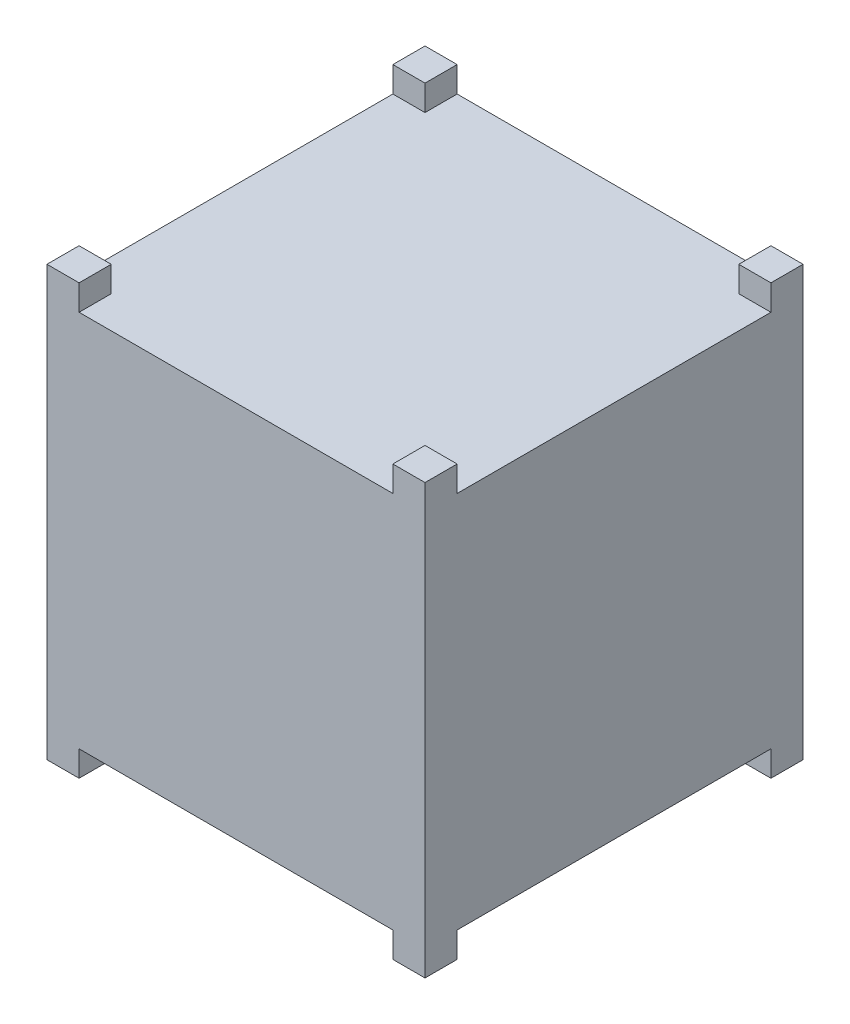
ISO-10303-21;
HEADER;
FILE_DESCRIPTION(('STEP AP214'),'2;1');
FILE_NAME('part.step','',(''),(''),'','','');
FILE_SCHEMA(('AUTOMOTIVE_DESIGN { 1 0 10303 214 1 1 1 1 }'));
ENDSEC;
DATA;
#1=APPLICATION_CONTEXT('core data for automotive mechanical design processes');
#2=APPLICATION_PROTOCOL_DEFINITION('international standard','automotive_design',2000,#1);
#3=PRODUCT_CONTEXT('',#1,'mechanical');
#4=PRODUCT('Part','Part','',(#3));
#5=PRODUCT_RELATED_PRODUCT_CATEGORY('part','',(#4));
#6=PRODUCT_DEFINITION_FORMATION('','',#4);
#7=PRODUCT_DEFINITION_CONTEXT('part definition',#1,'design');
#8=PRODUCT_DEFINITION('design','',#6,#7);
#9=PRODUCT_DEFINITION_SHAPE('','',#8);
#10=(LENGTH_UNIT() NAMED_UNIT(*) SI_UNIT(.MILLI.,.METRE.));
#11=(NAMED_UNIT(*) PLANE_ANGLE_UNIT() SI_UNIT($,.RADIAN.));
#12=(NAMED_UNIT(*) SI_UNIT($,.STERADIAN.) SOLID_ANGLE_UNIT());
#13=UNCERTAINTY_MEASURE_WITH_UNIT(LENGTH_MEASURE(1.E-05),#10,'distance_accuracy_value','');
#14=(GEOMETRIC_REPRESENTATION_CONTEXT(3) GLOBAL_UNCERTAINTY_ASSIGNED_CONTEXT((#13)) GLOBAL_UNIT_ASSIGNED_CONTEXT((#10,
#11,#12)) REPRESENTATION_CONTEXT('',''));
#15=CARTESIAN_POINT('',(0.,0.,0.));
#16=DIRECTION('',(0.,0.,1.));
#17=DIRECTION('',(1.,0.,0.));
#18=AXIS2_PLACEMENT_3D('',#15,#16,#17);
#19=CARTESIAN_POINT('',(0.,113.5,0.));
#20=DIRECTION('',(0.,0.,-1.));
#21=DIRECTION('',(-1.,0.,0.));
#22=AXIS2_PLACEMENT_3D('',#19,#20,#21);
#23=PLANE('',#22);
#24=DIRECTION('',(0.,-1.,0.));
#25=VECTOR('',#24,1.);
#26=CARTESIAN_POINT('',(8.50000000000002,6.75,0.));
#27=LINE('',#26,#25);
#28=CARTESIAN_POINT('',(8.50000000000002,6.75,0.));
#29=VERTEX_POINT('',#28);
#30=CARTESIAN_POINT('',(8.50000000000002,0.,0.));
#31=VERTEX_POINT('',#30);
#32=EDGE_CURVE('E228',#29,#31,#27,.T.);
#33=ORIENTED_EDGE('',*,*,#32,.F.);
#34=DIRECTION('',(-1.,0.,0.));
#35=VECTOR('',#34,1.);
#36=CARTESIAN_POINT('',(0.,6.75,0.));
#37=LINE('',#36,#35);
#38=CARTESIAN_POINT('',(91.5,6.75,0.));
#39=VERTEX_POINT('',#38);
#40=EDGE_CURVE('E234',#39,#29,#37,.T.);
#41=ORIENTED_EDGE('',*,*,#40,.F.);
#42=DIRECTION('',(0.,-1.,0.));
#43=VECTOR('',#42,1.);
#44=CARTESIAN_POINT('',(91.5,6.75,0.));
#45=LINE('',#44,#43);
#46=CARTESIAN_POINT('',(91.5,0.,0.));
#47=VERTEX_POINT('',#46);
#48=EDGE_CURVE('E252',#39,#47,#45,.T.);
#49=ORIENTED_EDGE('',*,*,#48,.T.);
#50=DIRECTION('',(1.,0.,0.));
#51=VECTOR('',#50,1.);
#52=CARTESIAN_POINT('',(0.,0.,0.));
#53=LINE('',#52,#51);
#54=CARTESIAN_POINT('',(100.,0.,0.));
#55=VERTEX_POINT('',#54);
#56=EDGE_CURVE('E397',#47,#55,#53,.T.);
#57=ORIENTED_EDGE('',*,*,#56,.T.);
#58=DIRECTION('',(0.,-1.,0.));
#59=VECTOR('',#58,1.);
#60=CARTESIAN_POINT('',(100.,113.5,0.));
#61=LINE('',#60,#59);
#62=CARTESIAN_POINT('',(100.,113.5,0.));
#63=VERTEX_POINT('',#62);
#64=EDGE_CURVE('E48',#63,#55,#61,.T.);
#65=ORIENTED_EDGE('',*,*,#64,.F.);
#66=DIRECTION('',(1.,0.,0.));
#67=VECTOR('',#66,1.);
#68=CARTESIAN_POINT('',(0.,113.5,0.));
#69=LINE('',#68,#67);
#70=CARTESIAN_POINT('',(91.5,113.5,0.));
#71=VERTEX_POINT('',#70);
#72=EDGE_CURVE('E376',#71,#63,#69,.T.);
#73=ORIENTED_EDGE('',*,*,#72,.F.);
#74=DIRECTION('',(0.,1.,0.));
#75=VECTOR('',#74,1.);
#76=CARTESIAN_POINT('',(91.5,106.75,0.));
#77=LINE('',#76,#75);
#78=CARTESIAN_POINT('',(91.5,106.75,0.));
#79=VERTEX_POINT('',#78);
#80=EDGE_CURVE('E63',#79,#71,#77,.T.);
#81=ORIENTED_EDGE('',*,*,#80,.F.);
#82=DIRECTION('',(1.,0.,0.));
#83=VECTOR('',#82,1.);
#84=CARTESIAN_POINT('',(0.,106.75,0.));
#85=LINE('',#84,#83);
#86=CARTESIAN_POINT('',(8.50000000000002,106.75,0.));
#87=VERTEX_POINT('',#86);
#88=EDGE_CURVE('E266',#87,#79,#85,.T.);
#89=ORIENTED_EDGE('',*,*,#88,.F.);
#90=DIRECTION('',(0.,1.,0.));
#91=VECTOR('',#90,1.);
#92=CARTESIAN_POINT('',(8.50000000000002,106.75,0.));
#93=LINE('',#92,#91);
#94=CARTESIAN_POINT('',(8.50000000000002,113.5,0.));
#95=VERTEX_POINT('',#94);
#96=EDGE_CURVE('E306',#87,#95,#93,.T.);
#97=ORIENTED_EDGE('',*,*,#96,.T.);
#98=CARTESIAN_POINT('',(0.,113.5,0.));
#99=VERTEX_POINT('',#98);
#100=EDGE_CURVE('E378',#99,#95,#69,.T.);
#101=ORIENTED_EDGE('',*,*,#100,.F.);
#102=DIRECTION('',(0.,-1.,0.));
#103=VECTOR('',#102,1.);
#104=CARTESIAN_POINT('',(0.,113.5,0.));
#105=LINE('',#104,#103);
#106=CARTESIAN_POINT('',(0.,0.,0.));
#107=VERTEX_POINT('',#106);
#108=EDGE_CURVE('E11',#99,#107,#105,.T.);
#109=ORIENTED_EDGE('',*,*,#108,.T.);
#110=EDGE_CURVE('E249',#107,#31,#53,.T.);
#111=ORIENTED_EDGE('',*,*,#110,.T.);
#112=EDGE_LOOP('',(#33,#41,#49,#57,#65,#73,#81,#89,#97,#101,#109,#111));
#113=FACE_BOUND('',#112,.T.);
#114=ADVANCED_FACE('F39',(#113),#23,.F.);
#115=CARTESIAN_POINT('',(0.,113.5,0.));
#116=DIRECTION('',(1.,0.,0.));
#117=DIRECTION('',(0.,0.,-1.));
#118=AXIS2_PLACEMENT_3D('',#115,#116,#117);
#119=PLANE('',#118);
#120=DIRECTION('',(0.,-1.,0.));
#121=VECTOR('',#120,1.);
#122=CARTESIAN_POINT('',(0.,6.75,-91.5000000000001));
#123=LINE('',#122,#121);
#124=CARTESIAN_POINT('',(0.,6.75,-91.5000000000001));
#125=VERTEX_POINT('',#124);
#126=CARTESIAN_POINT('',(0.,0.,-91.5000000000001));
#127=VERTEX_POINT('',#126);
#128=EDGE_CURVE('E463',#125,#127,#123,.T.);
#129=ORIENTED_EDGE('',*,*,#128,.F.);
#130=DIRECTION('',(0.,0.,-1.));
#131=VECTOR('',#130,1.);
#132=CARTESIAN_POINT('',(0.,6.75,0.));
#133=LINE('',#132,#131);
#134=CARTESIAN_POINT('',(0.,6.75,-8.49999999999999));
#135=VERTEX_POINT('',#134);
#136=EDGE_CURVE('E518',#135,#125,#133,.T.);
#137=ORIENTED_EDGE('',*,*,#136,.F.);
#138=DIRECTION('',(0.,-1.,0.));
#139=VECTOR('',#138,1.);
#140=CARTESIAN_POINT('',(0.,6.75,-8.49999999999999));
#141=LINE('',#140,#139);
#142=CARTESIAN_POINT('',(0.,0.,-8.49999999999999));
#143=VERTEX_POINT('',#142);
#144=EDGE_CURVE('E458',#135,#143,#141,.T.);
#145=ORIENTED_EDGE('',*,*,#144,.T.);
#146=DIRECTION('',(0.,0.,1.));
#147=VECTOR('',#146,1.);
#148=CARTESIAN_POINT('',(0.,0.,0.));
#149=LINE('',#148,#147);
#150=EDGE_CURVE('E336',#143,#107,#149,.T.);
#151=ORIENTED_EDGE('',*,*,#150,.T.);
#152=ORIENTED_EDGE('',*,*,#108,.F.);
#153=DIRECTION('',(0.,0.,1.));
#154=VECTOR('',#153,1.);
#155=CARTESIAN_POINT('',(0.,113.5,0.));
#156=LINE('',#155,#154);
#157=CARTESIAN_POINT('',(0.,113.5,-8.49999999999999));
#158=VERTEX_POINT('',#157);
#159=EDGE_CURVE('E377',#158,#99,#156,.T.);
#160=ORIENTED_EDGE('',*,*,#159,.F.);
#161=DIRECTION('',(0.,1.,0.));
#162=VECTOR('',#161,1.);
#163=CARTESIAN_POINT('',(0.,106.75,-8.49999999999999));
#164=LINE('',#163,#162);
#165=CARTESIAN_POINT('',(0.,106.75,-8.49999999999999));
#166=VERTEX_POINT('',#165);
#167=EDGE_CURVE('E337',#166,#158,#164,.T.);
#168=ORIENTED_EDGE('',*,*,#167,.F.);
#169=DIRECTION('',(0.,0.,1.));
#170=VECTOR('',#169,1.);
#171=CARTESIAN_POINT('',(0.,106.75,0.));
#172=LINE('',#171,#170);
#173=CARTESIAN_POINT('',(0.,106.75,-91.5000000000001));
#174=VERTEX_POINT('',#173);
#175=EDGE_CURVE('E300',#174,#166,#172,.T.);
#176=ORIENTED_EDGE('',*,*,#175,.F.);
#177=DIRECTION('',(0.,1.,0.));
#178=VECTOR('',#177,1.);
#179=CARTESIAN_POINT('',(0.,106.75,-91.5000000000001));
#180=LINE('',#179,#178);
#181=CARTESIAN_POINT('',(0.,113.5,-91.5000000000001));
#182=VERTEX_POINT('',#181);
#183=EDGE_CURVE('E340',#174,#182,#180,.T.);
#184=ORIENTED_EDGE('',*,*,#183,.T.);
#185=CARTESIAN_POINT('',(0.,113.5,-100.));
#186=VERTEX_POINT('',#185);
#187=EDGE_CURVE('E372',#186,#182,#156,.T.);
#188=ORIENTED_EDGE('',*,*,#187,.F.);
#189=DIRECTION('',(0.,-1.,0.));
#190=VECTOR('',#189,1.);
#191=CARTESIAN_POINT('',(0.,113.5,-100.));
#192=LINE('',#191,#190);
#193=CARTESIAN_POINT('',(0.,0.,-100.));
#194=VERTEX_POINT('',#193);
#195=EDGE_CURVE('E392',#186,#194,#192,.T.);
#196=ORIENTED_EDGE('',*,*,#195,.T.);
#197=EDGE_CURVE('E393',#194,#127,#149,.T.);
#198=ORIENTED_EDGE('',*,*,#197,.T.);
#199=EDGE_LOOP('',(#129,#137,#145,#151,#152,#160,#168,#176,#184,#188,#196,#198));
#200=FACE_BOUND('',#199,.T.);
#201=ADVANCED_FACE('F41',(#200),#119,.F.);
#202=CARTESIAN_POINT('',(100.,113.5,0.));
#203=DIRECTION('',(-1.,0.,0.));
#204=DIRECTION('',(0.,0.,1.));
#205=AXIS2_PLACEMENT_3D('',#202,#203,#204);
#206=PLANE('',#205);
#207=DIRECTION('',(0.,-1.,0.));
#208=VECTOR('',#207,1.);
#209=CARTESIAN_POINT('',(100.,6.75,-8.50000000000001));
#210=LINE('',#209,#208);
#211=CARTESIAN_POINT('',(100.,6.75,-8.50000000000001));
#212=VERTEX_POINT('',#211);
#213=CARTESIAN_POINT('',(100.,0.,-8.50000000000001));
#214=VERTEX_POINT('',#213);
#215=EDGE_CURVE('E483',#212,#214,#210,.T.);
#216=ORIENTED_EDGE('',*,*,#215,.F.);
#217=DIRECTION('',(0.,0.,1.));
#218=VECTOR('',#217,1.);
#219=CARTESIAN_POINT('',(100.,6.75,0.));
#220=LINE('',#219,#218);
#221=CARTESIAN_POINT('',(100.,6.75,-91.5000000000001));
#222=VERTEX_POINT('',#221);
#223=EDGE_CURVE('E493',#222,#212,#220,.T.);
#224=ORIENTED_EDGE('',*,*,#223,.F.);
#225=DIRECTION('',(0.,-1.,0.));
#226=VECTOR('',#225,1.);
#227=CARTESIAN_POINT('',(100.,6.75,-91.5000000000001));
#228=LINE('',#227,#226);
#229=CARTESIAN_POINT('',(100.,0.,-91.5000000000001));
#230=VERTEX_POINT('',#229);
#231=EDGE_CURVE('E479',#222,#230,#228,.T.);
#232=ORIENTED_EDGE('',*,*,#231,.T.);
#233=DIRECTION('',(0.,0.,-1.));
#234=VECTOR('',#233,1.);
#235=CARTESIAN_POINT('',(100.,0.,0.));
#236=LINE('',#235,#234);
#237=CARTESIAN_POINT('',(100.,0.,-100.));
#238=VERTEX_POINT('',#237);
#239=EDGE_CURVE('E400',#230,#238,#236,.T.);
#240=ORIENTED_EDGE('',*,*,#239,.T.);
#241=DIRECTION('',(0.,-1.,0.));
#242=VECTOR('',#241,1.);
#243=CARTESIAN_POINT('',(100.,113.5,-100.));
#244=LINE('',#243,#242);
#245=CARTESIAN_POINT('',(100.,113.5,-100.));
#246=VERTEX_POINT('',#245);
#247=EDGE_CURVE('E413',#246,#238,#244,.T.);
#248=ORIENTED_EDGE('',*,*,#247,.F.);
#249=DIRECTION('',(0.,0.,-1.));
#250=VECTOR('',#249,1.);
#251=CARTESIAN_POINT('',(100.,113.5,0.));
#252=LINE('',#251,#250);
#253=CARTESIAN_POINT('',(100.,113.5,-91.5000000000001));
#254=VERTEX_POINT('',#253);
#255=EDGE_CURVE('E382',#254,#246,#252,.T.);
#256=ORIENTED_EDGE('',*,*,#255,.F.);
#257=DIRECTION('',(0.,1.,0.));
#258=VECTOR('',#257,1.);
#259=CARTESIAN_POINT('',(100.,106.75,-91.5000000000001));
#260=LINE('',#259,#258);
#261=CARTESIAN_POINT('',(100.,106.75,-91.5000000000001));
#262=VERTEX_POINT('',#261);
#263=EDGE_CURVE('E357',#262,#254,#260,.T.);
#264=ORIENTED_EDGE('',*,*,#263,.F.);
#265=DIRECTION('',(0.,0.,-1.));
#266=VECTOR('',#265,1.);
#267=CARTESIAN_POINT('',(100.,106.75,0.));
#268=LINE('',#267,#266);
#269=CARTESIAN_POINT('',(100.,106.75,-8.50000000000001));
#270=VERTEX_POINT('',#269);
#271=EDGE_CURVE('E278',#270,#262,#268,.T.);
#272=ORIENTED_EDGE('',*,*,#271,.F.);
#273=DIRECTION('',(0.,1.,0.));
#274=VECTOR('',#273,1.);
#275=CARTESIAN_POINT('',(100.,106.75,-8.50000000000001));
#276=LINE('',#275,#274);
#277=CARTESIAN_POINT('',(100.,113.5,-8.50000000000001));
#278=VERTEX_POINT('',#277);
#279=EDGE_CURVE('E360',#270,#278,#276,.T.);
#280=ORIENTED_EDGE('',*,*,#279,.T.);
#281=EDGE_CURVE('E383',#63,#278,#252,.T.);
#282=ORIENTED_EDGE('',*,*,#281,.F.);
#283=ORIENTED_EDGE('',*,*,#64,.T.);
#284=EDGE_CURVE('E401',#55,#214,#236,.T.);
#285=ORIENTED_EDGE('',*,*,#284,.T.);
#286=EDGE_LOOP('',(#216,#224,#232,#240,#248,#256,#264,#272,#280,#282,#283,#285));
#287=FACE_BOUND('',#286,.T.);
#288=ADVANCED_FACE('F423',(#287),#206,.F.);
#289=CARTESIAN_POINT('',(0.,113.5,-100.));
#290=DIRECTION('',(0.,0.,1.));
#291=DIRECTION('',(1.,0.,0.));
#292=AXIS2_PLACEMENT_3D('',#289,#290,#291);
#293=PLANE('',#292);
#294=DIRECTION('',(0.,-1.,0.));
#295=VECTOR('',#294,1.);
#296=CARTESIAN_POINT('',(91.5,6.75,-100.));
#297=LINE('',#296,#295);
#298=CARTESIAN_POINT('',(91.5,6.75,-100.));
#299=VERTEX_POINT('',#298);
#300=CARTESIAN_POINT('',(91.5,0.,-100.));
#301=VERTEX_POINT('',#300);
#302=EDGE_CURVE('E473',#299,#301,#297,.T.);
#303=ORIENTED_EDGE('',*,*,#302,.F.);
#304=DIRECTION('',(1.,0.,0.));
#305=VECTOR('',#304,1.);
#306=CARTESIAN_POINT('',(0.,6.75,-100.));
#307=LINE('',#306,#305);
#308=CARTESIAN_POINT('',(8.5,6.75,-100.));
#309=VERTEX_POINT('',#308);
#310=EDGE_CURVE('E507',#309,#299,#307,.T.);
#311=ORIENTED_EDGE('',*,*,#310,.F.);
#312=DIRECTION('',(0.,-1.,0.));
#313=VECTOR('',#312,1.);
#314=CARTESIAN_POINT('',(8.5,6.75,-100.));
#315=LINE('',#314,#313);
#316=CARTESIAN_POINT('',(8.5,0.,-100.));
#317=VERTEX_POINT('',#316);
#318=EDGE_CURVE('E469',#309,#317,#315,.T.);
#319=ORIENTED_EDGE('',*,*,#318,.T.);
#320=DIRECTION('',(-1.,0.,0.));
#321=VECTOR('',#320,1.);
#322=CARTESIAN_POINT('',(0.,0.,-100.));
#323=LINE('',#322,#321);
#324=EDGE_CURVE('E405',#317,#194,#323,.T.);
#325=ORIENTED_EDGE('',*,*,#324,.T.);
#326=ORIENTED_EDGE('',*,*,#195,.F.);
#327=DIRECTION('',(-1.,0.,0.));
#328=VECTOR('',#327,1.);
#329=CARTESIAN_POINT('',(0.,113.5,-100.));
#330=LINE('',#329,#328);
#331=CARTESIAN_POINT('',(8.5,113.5,-100.));
#332=VERTEX_POINT('',#331);
#333=EDGE_CURVE('E387',#332,#186,#330,.T.);
#334=ORIENTED_EDGE('',*,*,#333,.F.);
#335=DIRECTION('',(0.,1.,0.));
#336=VECTOR('',#335,1.);
#337=CARTESIAN_POINT('',(8.5,106.75,-100.));
#338=LINE('',#337,#336);
#339=CARTESIAN_POINT('',(8.5,106.75,-100.));
#340=VERTEX_POINT('',#339);
#341=EDGE_CURVE('E347',#340,#332,#338,.T.);
#342=ORIENTED_EDGE('',*,*,#341,.F.);
#343=DIRECTION('',(-1.,0.,0.));
#344=VECTOR('',#343,1.);
#345=CARTESIAN_POINT('',(0.,106.75,-100.));
#346=LINE('',#345,#344);
#347=CARTESIAN_POINT('',(91.5,106.75,-100.));
#348=VERTEX_POINT('',#347);
#349=EDGE_CURVE('E289',#348,#340,#346,.T.);
#350=ORIENTED_EDGE('',*,*,#349,.F.);
#351=DIRECTION('',(0.,1.,0.));
#352=VECTOR('',#351,1.);
#353=CARTESIAN_POINT('',(91.5,106.75,-100.));
#354=LINE('',#353,#352);
#355=CARTESIAN_POINT('',(91.5,113.5,-100.));
#356=VERTEX_POINT('',#355);
#357=EDGE_CURVE('E350',#348,#356,#354,.T.);
#358=ORIENTED_EDGE('',*,*,#357,.T.);
#359=EDGE_CURVE('E388',#246,#356,#330,.T.);
#360=ORIENTED_EDGE('',*,*,#359,.F.);
#361=ORIENTED_EDGE('',*,*,#247,.T.);
#362=EDGE_CURVE('E406',#238,#301,#323,.T.);
#363=ORIENTED_EDGE('',*,*,#362,.T.);
#364=EDGE_LOOP('',(#303,#311,#319,#325,#326,#334,#342,#350,#358,#360,#361,#363));
#365=FACE_BOUND('',#364,.T.);
#366=ADVANCED_FACE('F545',(#365),#293,.F.);
#367=CARTESIAN_POINT('',(0.,0.,0.));
#368=DIRECTION('',(0.,-1.,0.));
#369=DIRECTION('',(0.,0.,-1.));
#370=AXIS2_PLACEMENT_3D('',#367,#368,#369);
#371=PLANE('',#370);
#372=DIRECTION('',(0.,0.,1.));
#373=VECTOR('',#372,1.);
#374=CARTESIAN_POINT('',(91.5,0.,0.));
#375=LINE('',#374,#373);
#376=CARTESIAN_POINT('',(91.5,0.,-8.50000000000001));
#377=VERTEX_POINT('',#376);
#378=EDGE_CURVE('E432',#377,#47,#375,.T.);
#379=ORIENTED_EDGE('',*,*,#378,.F.);
#380=DIRECTION('',(1.,0.,0.));
#381=VECTOR('',#380,1.);
#382=CARTESIAN_POINT('',(0.,0.,-8.49999999999999));
#383=LINE('',#382,#381);
#384=EDGE_CURVE('E431',#377,#214,#383,.T.);
#385=ORIENTED_EDGE('',*,*,#384,.T.);
#386=ORIENTED_EDGE('',*,*,#284,.F.);
#387=ORIENTED_EDGE('',*,*,#56,.F.);
#388=EDGE_LOOP('',(#379,#385,#386,#387));
#389=FACE_BOUND('',#388,.T.);
#390=ADVANCED_FACE('F429',(#389),#371,.T.);
#391=DIRECTION('',(1.,0.,0.));
#392=VECTOR('',#391,1.);
#393=CARTESIAN_POINT('',(0.,0.,-91.5000000000001));
#394=LINE('',#393,#392);
#395=CARTESIAN_POINT('',(91.5,0.,-91.5000000000001));
#396=VERTEX_POINT('',#395);
#397=EDGE_CURVE('E435',#396,#230,#394,.T.);
#398=ORIENTED_EDGE('',*,*,#397,.F.);
#399=DIRECTION('',(0.,0.,-1.));
#400=VECTOR('',#399,1.);
#401=CARTESIAN_POINT('',(91.5,0.,0.));
#402=LINE('',#401,#400);
#403=EDGE_CURVE('E439',#396,#301,#402,.T.);
#404=ORIENTED_EDGE('',*,*,#403,.T.);
#405=ORIENTED_EDGE('',*,*,#362,.F.);
#406=ORIENTED_EDGE('',*,*,#239,.F.);
#407=EDGE_LOOP('',(#398,#404,#405,#406));
#408=FACE_BOUND('',#407,.T.);
#409=ADVANCED_FACE('F562',(#408),#371,.T.);
#410=DIRECTION('',(-1.,0.,0.));
#411=VECTOR('',#410,1.);
#412=CARTESIAN_POINT('',(0.,0.,-8.49999999999999));
#413=LINE('',#412,#411);
#414=CARTESIAN_POINT('',(8.50000000000002,0.,-8.49999999999999));
#415=VERTEX_POINT('',#414);
#416=EDGE_CURVE('E235',#415,#143,#413,.T.);
#417=ORIENTED_EDGE('',*,*,#416,.F.);
#418=DIRECTION('',(0.,0.,1.));
#419=VECTOR('',#418,1.);
#420=CARTESIAN_POINT('',(8.50000000000002,0.,0.));
#421=LINE('',#420,#419);
#422=EDGE_CURVE('E55',#415,#31,#421,.T.);
#423=ORIENTED_EDGE('',*,*,#422,.T.);
#424=ORIENTED_EDGE('',*,*,#110,.F.);
#425=ORIENTED_EDGE('',*,*,#150,.F.);
#426=EDGE_LOOP('',(#417,#423,#424,#425));
#427=FACE_BOUND('',#426,.T.);
#428=ADVANCED_FACE('F526',(#427),#371,.T.);
#429=CARTESIAN_POINT('',(0.,113.5,0.));
#430=DIRECTION('',(0.,-1.,0.));
#431=DIRECTION('',(0.,0.,-1.));
#432=AXIS2_PLACEMENT_3D('',#429,#430,#431);
#433=PLANE('',#432);
#434=DIRECTION('',(0.,0.,-1.));
#435=VECTOR('',#434,1.);
#436=CARTESIAN_POINT('',(8.50000000000002,113.5,0.));
#437=LINE('',#436,#435);
#438=CARTESIAN_POINT('',(8.50000000000002,113.5,-8.49999999999999));
#439=VERTEX_POINT('',#438);
#440=EDGE_CURVE('E251',#95,#439,#437,.T.);
#441=ORIENTED_EDGE('',*,*,#440,.T.);
#442=DIRECTION('',(1.,0.,0.));
#443=VECTOR('',#442,1.);
#444=CARTESIAN_POINT('',(0.,113.5,-8.49999999999999));
#445=LINE('',#444,#443);
#446=EDGE_CURVE('E267',#158,#439,#445,.T.);
#447=ORIENTED_EDGE('',*,*,#446,.F.);
#448=ORIENTED_EDGE('',*,*,#159,.T.);
#449=ORIENTED_EDGE('',*,*,#100,.T.);
#450=EDGE_LOOP('',(#441,#447,#448,#449));
#451=FACE_BOUND('',#450,.T.);
#452=ADVANCED_FACE('F591',(#451),#433,.F.);
#453=DIRECTION('',(1.,0.,0.));
#454=VECTOR('',#453,1.);
#455=CARTESIAN_POINT('',(0.,113.5,-91.5000000000001));
#456=LINE('',#455,#454);
#457=CARTESIAN_POINT('',(8.50000000000001,113.5,-91.5000000000001));
#458=VERTEX_POINT('',#457);
#459=EDGE_CURVE('E326',#182,#458,#456,.T.);
#460=ORIENTED_EDGE('',*,*,#459,.T.);
#461=DIRECTION('',(0.,0.,1.));
#462=VECTOR('',#461,1.);
#463=CARTESIAN_POINT('',(8.50000000000005,113.5,0.));
#464=LINE('',#463,#462);
#465=EDGE_CURVE('E322',#332,#458,#464,.T.);
#466=ORIENTED_EDGE('',*,*,#465,.F.);
#467=ORIENTED_EDGE('',*,*,#333,.T.);
#468=ORIENTED_EDGE('',*,*,#187,.T.);
#469=EDGE_LOOP('',(#460,#466,#467,#468));
#470=FACE_BOUND('',#469,.T.);
#471=ADVANCED_FACE('F594',(#470),#433,.F.);
#472=DIRECTION('',(0.,0.,1.));
#473=VECTOR('',#472,1.);
#474=CARTESIAN_POINT('',(91.5,113.5,0.));
#475=LINE('',#474,#473);
#476=CARTESIAN_POINT('',(91.5,113.5,-91.5000000000001));
#477=VERTEX_POINT('',#476);
#478=EDGE_CURVE('E318',#356,#477,#475,.T.);
#479=ORIENTED_EDGE('',*,*,#478,.T.);
#480=DIRECTION('',(-1.,0.,0.));
#481=VECTOR('',#480,1.);
#482=CARTESIAN_POINT('',(0.,113.5,-91.5000000000001));
#483=LINE('',#482,#481);
#484=EDGE_CURVE('E314',#254,#477,#483,.T.);
#485=ORIENTED_EDGE('',*,*,#484,.F.);
#486=ORIENTED_EDGE('',*,*,#255,.T.);
#487=ORIENTED_EDGE('',*,*,#359,.T.);
#488=EDGE_LOOP('',(#479,#485,#486,#487));
#489=FACE_BOUND('',#488,.T.);
#490=ADVANCED_FACE('F710',(#489),#433,.F.);
#491=DIRECTION('',(-1.,0.,0.));
#492=VECTOR('',#491,1.);
#493=CARTESIAN_POINT('',(0.,113.5,-8.49999999999999));
#494=LINE('',#493,#492);
#495=CARTESIAN_POINT('',(91.5,113.5,-8.50000000000001));
#496=VERTEX_POINT('',#495);
#497=EDGE_CURVE('E310',#278,#496,#494,.T.);
#498=ORIENTED_EDGE('',*,*,#497,.T.);
#499=DIRECTION('',(0.,0.,-1.));
#500=VECTOR('',#499,1.);
#501=CARTESIAN_POINT('',(91.5,113.5,0.));
#502=LINE('',#501,#500);
#503=EDGE_CURVE('E257',#71,#496,#502,.T.);
#504=ORIENTED_EDGE('',*,*,#503,.F.);
#505=ORIENTED_EDGE('',*,*,#72,.T.);
#506=ORIENTED_EDGE('',*,*,#281,.T.);
#507=EDGE_LOOP('',(#498,#504,#505,#506));
#508=FACE_BOUND('',#507,.T.);
#509=ADVANCED_FACE('F590',(#508),#433,.F.);
#510=DIRECTION('',(0.,0.,-1.));
#511=VECTOR('',#510,1.);
#512=CARTESIAN_POINT('',(8.50000000000005,0.,0.));
#513=LINE('',#512,#511);
#514=CARTESIAN_POINT('',(8.50000000000001,0.,-91.5000000000001));
#515=VERTEX_POINT('',#514);
#516=EDGE_CURVE('E447',#515,#317,#513,.T.);
#517=ORIENTED_EDGE('',*,*,#516,.F.);
#518=DIRECTION('',(-1.,0.,0.));
#519=VECTOR('',#518,1.);
#520=CARTESIAN_POINT('',(0.,0.,-91.5000000000001));
#521=LINE('',#520,#519);
#522=EDGE_CURVE('E450',#515,#127,#521,.T.);
#523=ORIENTED_EDGE('',*,*,#522,.T.);
#524=ORIENTED_EDGE('',*,*,#197,.F.);
#525=ORIENTED_EDGE('',*,*,#324,.F.);
#526=EDGE_LOOP('',(#517,#523,#524,#525));
#527=FACE_BOUND('',#526,.T.);
#528=ADVANCED_FACE('F549',(#527),#371,.T.);
#529=CARTESIAN_POINT('',(8.50000000000002,106.75,0.));
#530=DIRECTION('',(1.,0.,0.));
#531=DIRECTION('',(0.,0.,-1.));
#532=AXIS2_PLACEMENT_3D('',#529,#530,#531);
#533=PLANE('',#532);
#534=ORIENTED_EDGE('',*,*,#440,.F.);
#535=ORIENTED_EDGE('',*,*,#96,.F.);
#536=DIRECTION('',(0.,0.,-1.));
#537=VECTOR('',#536,1.);
#538=CARTESIAN_POINT('',(8.50000000000002,106.75,0.));
#539=LINE('',#538,#537);
#540=CARTESIAN_POINT('',(8.50000000000002,106.75,-8.49999999999999));
#541=VERTEX_POINT('',#540);
#542=EDGE_CURVE('E263',#87,#541,#539,.T.);
#543=ORIENTED_EDGE('',*,*,#542,.T.);
#544=DIRECTION('',(0.,1.,0.));
#545=VECTOR('',#544,1.);
#546=CARTESIAN_POINT('',(8.50000000000002,106.75,-8.49999999999999));
#547=LINE('',#546,#545);
#548=EDGE_CURVE('E333',#541,#439,#547,.T.);
#549=ORIENTED_EDGE('',*,*,#548,.T.);
#550=EDGE_LOOP('',(#534,#535,#543,#549));
#551=FACE_BOUND('',#550,.T.);
#552=ADVANCED_FACE('F589',(#551),#533,.T.);
#553=CARTESIAN_POINT('',(0.,106.75,-8.49999999999999));
#554=DIRECTION('',(0.,0.,1.));
#555=DIRECTION('',(1.,0.,0.));
#556=AXIS2_PLACEMENT_3D('',#553,#554,#555);
#557=PLANE('',#556);
#558=ORIENTED_EDGE('',*,*,#446,.T.);
#559=ORIENTED_EDGE('',*,*,#548,.F.);
#560=DIRECTION('',(1.,0.,0.));
#561=VECTOR('',#560,1.);
#562=CARTESIAN_POINT('',(0.,106.75,-8.49999999999999));
#563=LINE('',#562,#561);
#564=EDGE_CURVE('E303',#166,#541,#563,.T.);
#565=ORIENTED_EDGE('',*,*,#564,.F.);
#566=ORIENTED_EDGE('',*,*,#167,.T.);
#567=EDGE_LOOP('',(#558,#559,#565,#566));
#568=FACE_BOUND('',#567,.T.);
#569=ADVANCED_FACE('F598',(#568),#557,.F.);
#570=CARTESIAN_POINT('',(0.,106.75,-91.5000000000001));
#571=DIRECTION('',(0.,0.,1.));
#572=DIRECTION('',(1.,0.,0.));
#573=AXIS2_PLACEMENT_3D('',#570,#571,#572);
#574=PLANE('',#573);
#575=ORIENTED_EDGE('',*,*,#459,.F.);
#576=ORIENTED_EDGE('',*,*,#183,.F.);
#577=DIRECTION('',(1.,0.,0.));
#578=VECTOR('',#577,1.);
#579=CARTESIAN_POINT('',(0.,106.75,-91.5000000000001));
#580=LINE('',#579,#578);
#581=CARTESIAN_POINT('',(8.50000000000001,106.75,-91.5000000000001));
#582=VERTEX_POINT('',#581);
#583=EDGE_CURVE('E297',#174,#582,#580,.T.);
#584=ORIENTED_EDGE('',*,*,#583,.T.);
#585=DIRECTION('',(0.,1.,0.));
#586=VECTOR('',#585,1.);
#587=CARTESIAN_POINT('',(8.50000000000001,106.75,-91.5000000000001));
#588=LINE('',#587,#586);
#589=EDGE_CURVE('E344',#582,#458,#588,.T.);
#590=ORIENTED_EDGE('',*,*,#589,.T.);
#591=EDGE_LOOP('',(#575,#576,#584,#590));
#592=FACE_BOUND('',#591,.T.);
#593=ADVANCED_FACE('F619',(#592),#574,.T.);
#594=CARTESIAN_POINT('',(8.50000000000005,106.75,0.));
#595=DIRECTION('',(-1.,0.,0.));
#596=DIRECTION('',(0.,0.,1.));
#597=AXIS2_PLACEMENT_3D('',#594,#595,#596);
#598=PLANE('',#597);
#599=ORIENTED_EDGE('',*,*,#465,.T.);
#600=ORIENTED_EDGE('',*,*,#589,.F.);
#601=DIRECTION('',(0.,0.,1.));
#602=VECTOR('',#601,1.);
#603=CARTESIAN_POINT('',(8.50000000000005,106.75,0.));
#604=LINE('',#603,#602);
#605=EDGE_CURVE('E293',#340,#582,#604,.T.);
#606=ORIENTED_EDGE('',*,*,#605,.F.);
#607=ORIENTED_EDGE('',*,*,#341,.T.);
#608=EDGE_LOOP('',(#599,#600,#606,#607));
#609=FACE_BOUND('',#608,.T.);
#610=ADVANCED_FACE('F615',(#609),#598,.F.);
#611=CARTESIAN_POINT('',(91.5,106.75,0.));
#612=DIRECTION('',(-1.,0.,0.));
#613=DIRECTION('',(0.,0.,1.));
#614=AXIS2_PLACEMENT_3D('',#611,#612,#613);
#615=PLANE('',#614);
#616=ORIENTED_EDGE('',*,*,#478,.F.);
#617=ORIENTED_EDGE('',*,*,#357,.F.);
#618=DIRECTION('',(0.,0.,1.));
#619=VECTOR('',#618,1.);
#620=CARTESIAN_POINT('',(91.5,106.75,0.));
#621=LINE('',#620,#619);
#622=CARTESIAN_POINT('',(91.5,106.75,-91.5000000000001));
#623=VERTEX_POINT('',#622);
#624=EDGE_CURVE('E286',#348,#623,#621,.T.);
#625=ORIENTED_EDGE('',*,*,#624,.T.);
#626=DIRECTION('',(0.,1.,0.));
#627=VECTOR('',#626,1.);
#628=CARTESIAN_POINT('',(91.5,106.75,-91.5000000000001));
#629=LINE('',#628,#627);
#630=EDGE_CURVE('E354',#623,#477,#629,.T.);
#631=ORIENTED_EDGE('',*,*,#630,.T.);
#632=EDGE_LOOP('',(#616,#617,#625,#631));
#633=FACE_BOUND('',#632,.T.);
#634=ADVANCED_FACE('F611',(#633),#615,.T.);
#635=CARTESIAN_POINT('',(0.,106.75,-91.5000000000001));
#636=DIRECTION('',(0.,0.,-1.));
#637=DIRECTION('',(-1.,0.,0.));
#638=AXIS2_PLACEMENT_3D('',#635,#636,#637);
#639=PLANE('',#638);
#640=ORIENTED_EDGE('',*,*,#484,.T.);
#641=ORIENTED_EDGE('',*,*,#630,.F.);
#642=DIRECTION('',(-1.,0.,0.));
#643=VECTOR('',#642,1.);
#644=CARTESIAN_POINT('',(0.,106.75,-91.5000000000001));
#645=LINE('',#644,#643);
#646=EDGE_CURVE('E282',#262,#623,#645,.T.);
#647=ORIENTED_EDGE('',*,*,#646,.F.);
#648=ORIENTED_EDGE('',*,*,#263,.T.);
#649=EDGE_LOOP('',(#640,#641,#647,#648));
#650=FACE_BOUND('',#649,.T.);
#651=ADVANCED_FACE('F607',(#650),#639,.F.);
#652=CARTESIAN_POINT('',(0.,106.75,-8.49999999999999));
#653=DIRECTION('',(0.,0.,-1.));
#654=DIRECTION('',(-1.,0.,0.));
#655=AXIS2_PLACEMENT_3D('',#652,#653,#654);
#656=PLANE('',#655);
#657=ORIENTED_EDGE('',*,*,#497,.F.);
#658=ORIENTED_EDGE('',*,*,#279,.F.);
#659=DIRECTION('',(-1.,0.,0.));
#660=VECTOR('',#659,1.);
#661=CARTESIAN_POINT('',(0.,106.75,-8.49999999999999));
#662=LINE('',#661,#660);
#663=CARTESIAN_POINT('',(91.5,106.75,-8.50000000000001));
#664=VERTEX_POINT('',#663);
#665=EDGE_CURVE('E275',#270,#664,#662,.T.);
#666=ORIENTED_EDGE('',*,*,#665,.T.);
#667=DIRECTION('',(0.,1.,0.));
#668=VECTOR('',#667,1.);
#669=CARTESIAN_POINT('',(91.5,106.75,-8.50000000000001));
#670=LINE('',#669,#668);
#671=EDGE_CURVE('E364',#664,#496,#670,.T.);
#672=ORIENTED_EDGE('',*,*,#671,.T.);
#673=EDGE_LOOP('',(#657,#658,#666,#672));
#674=FACE_BOUND('',#673,.T.);
#675=ADVANCED_FACE('F604',(#674),#656,.T.);
#676=CARTESIAN_POINT('',(91.5,106.75,0.));
#677=DIRECTION('',(1.,0.,0.));
#678=DIRECTION('',(0.,0.,-1.));
#679=AXIS2_PLACEMENT_3D('',#676,#677,#678);
#680=PLANE('',#679);
#681=ORIENTED_EDGE('',*,*,#503,.T.);
#682=ORIENTED_EDGE('',*,*,#671,.F.);
#683=DIRECTION('',(0.,0.,-1.));
#684=VECTOR('',#683,1.);
#685=CARTESIAN_POINT('',(91.5,106.75,0.));
#686=LINE('',#685,#684);
#687=EDGE_CURVE('E271',#79,#664,#686,.T.);
#688=ORIENTED_EDGE('',*,*,#687,.F.);
#689=ORIENTED_EDGE('',*,*,#80,.T.);
#690=EDGE_LOOP('',(#681,#682,#688,#689));
#691=FACE_BOUND('',#690,.T.);
#692=ADVANCED_FACE('F600',(#691),#680,.F.);
#693=CARTESIAN_POINT('',(0.,106.75,0.));
#694=DIRECTION('',(0.,1.,0.));
#695=DIRECTION('',(0.,0.,1.));
#696=AXIS2_PLACEMENT_3D('',#693,#694,#695);
#697=PLANE('',#696);
#698=ORIENTED_EDGE('',*,*,#542,.F.);
#699=ORIENTED_EDGE('',*,*,#88,.T.);
#700=ORIENTED_EDGE('',*,*,#687,.T.);
#701=ORIENTED_EDGE('',*,*,#665,.F.);
#702=ORIENTED_EDGE('',*,*,#271,.T.);
#703=ORIENTED_EDGE('',*,*,#646,.T.);
#704=ORIENTED_EDGE('',*,*,#624,.F.);
#705=ORIENTED_EDGE('',*,*,#349,.T.);
#706=ORIENTED_EDGE('',*,*,#605,.T.);
#707=ORIENTED_EDGE('',*,*,#583,.F.);
#708=ORIENTED_EDGE('',*,*,#175,.T.);
#709=ORIENTED_EDGE('',*,*,#564,.T.);
#710=EDGE_LOOP('',(#698,#699,#700,#701,#702,#703,#704,#705,#706,#707,#708,#709));
#711=FACE_BOUND('',#710,.T.);
#712=ADVANCED_FACE('F603',(#711),#697,.T.);
#713=CARTESIAN_POINT('',(8.50000000000002,6.75,0.));
#714=DIRECTION('',(1.,0.,0.));
#715=DIRECTION('',(0.,0.,-1.));
#716=AXIS2_PLACEMENT_3D('',#713,#714,#715);
#717=PLANE('',#716);
#718=ORIENTED_EDGE('',*,*,#422,.F.);
#719=DIRECTION('',(0.,-1.,0.));
#720=VECTOR('',#719,1.);
#721=CARTESIAN_POINT('',(8.50000000000002,6.75,-8.49999999999999));
#722=LINE('',#721,#720);
#723=CARTESIAN_POINT('',(8.50000000000002,6.75,-8.49999999999999));
#724=VERTEX_POINT('',#723);
#725=EDGE_CURVE('E229',#724,#415,#722,.T.);
#726=ORIENTED_EDGE('',*,*,#725,.F.);
#727=DIRECTION('',(0.,0.,1.));
#728=VECTOR('',#727,1.);
#729=CARTESIAN_POINT('',(8.50000000000002,6.75,0.));
#730=LINE('',#729,#728);
#731=EDGE_CURVE('E224',#724,#29,#730,.T.);
#732=ORIENTED_EDGE('',*,*,#731,.T.);
#733=ORIENTED_EDGE('',*,*,#32,.T.);
#734=EDGE_LOOP('',(#718,#726,#732,#733));
#735=FACE_BOUND('',#734,.T.);
#736=ADVANCED_FACE('F226',(#735),#717,.T.);
#737=CARTESIAN_POINT('',(91.5,6.75,0.));
#738=DIRECTION('',(1.,0.,0.));
#739=DIRECTION('',(0.,0.,-1.));
#740=AXIS2_PLACEMENT_3D('',#737,#738,#739);
#741=PLANE('',#740);
#742=ORIENTED_EDGE('',*,*,#378,.T.);
#743=ORIENTED_EDGE('',*,*,#48,.F.);
#744=DIRECTION('',(0.,0.,1.));
#745=VECTOR('',#744,1.);
#746=CARTESIAN_POINT('',(91.5,6.75,0.));
#747=LINE('',#746,#745);
#748=CARTESIAN_POINT('',(91.5,6.75,-8.50000000000001));
#749=VERTEX_POINT('',#748);
#750=EDGE_CURVE('E242',#749,#39,#747,.T.);
#751=ORIENTED_EDGE('',*,*,#750,.F.);
#752=DIRECTION('',(0.,-1.,0.));
#753=VECTOR('',#752,1.);
#754=CARTESIAN_POINT('',(91.5,6.75,-8.50000000000001));
#755=LINE('',#754,#753);
#756=EDGE_CURVE('E259',#749,#377,#755,.T.);
#757=ORIENTED_EDGE('',*,*,#756,.T.);
#758=EDGE_LOOP('',(#742,#743,#751,#757));
#759=FACE_BOUND('',#758,.T.);
#760=ADVANCED_FACE('F487',(#759),#741,.F.);
#761=CARTESIAN_POINT('',(0.,6.75,-8.49999999999999));
#762=DIRECTION('',(0.,0.,-1.));
#763=DIRECTION('',(-1.,0.,0.));
#764=AXIS2_PLACEMENT_3D('',#761,#762,#763);
#765=PLANE('',#764);
#766=ORIENTED_EDGE('',*,*,#384,.F.);
#767=ORIENTED_EDGE('',*,*,#756,.F.);
#768=DIRECTION('',(1.,0.,0.));
#769=VECTOR('',#768,1.);
#770=CARTESIAN_POINT('',(0.,6.75,-8.49999999999999));
#771=LINE('',#770,#769);
#772=EDGE_CURVE('E489',#749,#212,#771,.T.);
#773=ORIENTED_EDGE('',*,*,#772,.T.);
#774=ORIENTED_EDGE('',*,*,#215,.T.);
#775=EDGE_LOOP('',(#766,#767,#773,#774));
#776=FACE_BOUND('',#775,.T.);
#777=ADVANCED_FACE('F488',(#776),#765,.T.);
#778=CARTESIAN_POINT('',(0.,6.75,-91.5000000000001));
#779=DIRECTION('',(0.,0.,-1.));
#780=DIRECTION('',(-1.,0.,0.));
#781=AXIS2_PLACEMENT_3D('',#778,#779,#780);
#782=PLANE('',#781);
#783=ORIENTED_EDGE('',*,*,#397,.T.);
#784=ORIENTED_EDGE('',*,*,#231,.F.);
#785=DIRECTION('',(1.,0.,0.));
#786=VECTOR('',#785,1.);
#787=CARTESIAN_POINT('',(0.,6.75,-91.5000000000001));
#788=LINE('',#787,#786);
#789=CARTESIAN_POINT('',(91.5,6.75,-91.5000000000001));
#790=VERTEX_POINT('',#789);
#791=EDGE_CURVE('E498',#790,#222,#788,.T.);
#792=ORIENTED_EDGE('',*,*,#791,.F.);
#793=DIRECTION('',(0.,-1.,0.));
#794=VECTOR('',#793,1.);
#795=CARTESIAN_POINT('',(91.5,6.75,-91.5000000000001));
#796=LINE('',#795,#794);
#797=EDGE_CURVE('E476',#790,#396,#796,.T.);
#798=ORIENTED_EDGE('',*,*,#797,.T.);
#799=EDGE_LOOP('',(#783,#784,#792,#798));
#800=FACE_BOUND('',#799,.T.);
#801=ADVANCED_FACE('F569',(#800),#782,.F.);
#802=CARTESIAN_POINT('',(91.5,6.75,0.));
#803=DIRECTION('',(-1.,0.,0.));
#804=DIRECTION('',(0.,0.,1.));
#805=AXIS2_PLACEMENT_3D('',#802,#803,#804);
#806=PLANE('',#805);
#807=ORIENTED_EDGE('',*,*,#403,.F.);
#808=ORIENTED_EDGE('',*,*,#797,.F.);
#809=DIRECTION('',(0.,0.,-1.));
#810=VECTOR('',#809,1.);
#811=CARTESIAN_POINT('',(91.5,6.75,0.));
#812=LINE('',#811,#810);
#813=EDGE_CURVE('E504',#790,#299,#812,.T.);
#814=ORIENTED_EDGE('',*,*,#813,.T.);
#815=ORIENTED_EDGE('',*,*,#302,.T.);
#816=EDGE_LOOP('',(#807,#808,#814,#815));
#817=FACE_BOUND('',#816,.T.);
#818=ADVANCED_FACE('F565',(#817),#806,.T.);
#819=CARTESIAN_POINT('',(8.50000000000005,6.75,0.));
#820=DIRECTION('',(-1.,0.,0.));
#821=DIRECTION('',(0.,0.,1.));
#822=AXIS2_PLACEMENT_3D('',#819,#820,#821);
#823=PLANE('',#822);
#824=ORIENTED_EDGE('',*,*,#516,.T.);
#825=ORIENTED_EDGE('',*,*,#318,.F.);
#826=DIRECTION('',(0.,0.,-1.));
#827=VECTOR('',#826,1.);
#828=CARTESIAN_POINT('',(8.50000000000005,6.75,0.));
#829=LINE('',#828,#827);
#830=CARTESIAN_POINT('',(8.50000000000001,6.75,-91.5000000000001));
#831=VERTEX_POINT('',#830);
#832=EDGE_CURVE('E511',#831,#309,#829,.T.);
#833=ORIENTED_EDGE('',*,*,#832,.F.);
#834=DIRECTION('',(0.,-1.,0.));
#835=VECTOR('',#834,1.);
#836=CARTESIAN_POINT('',(8.50000000000001,6.75,-91.5000000000001));
#837=LINE('',#836,#835);
#838=EDGE_CURVE('E466',#831,#515,#837,.T.);
#839=ORIENTED_EDGE('',*,*,#838,.T.);
#840=EDGE_LOOP('',(#824,#825,#833,#839));
#841=FACE_BOUND('',#840,.T.);
#842=ADVANCED_FACE('F539',(#841),#823,.F.);
#843=CARTESIAN_POINT('',(0.,6.75,-91.5000000000001));
#844=DIRECTION('',(0.,0.,1.));
#845=DIRECTION('',(1.,0.,0.));
#846=AXIS2_PLACEMENT_3D('',#843,#844,#845);
#847=PLANE('',#846);
#848=ORIENTED_EDGE('',*,*,#522,.F.);
#849=ORIENTED_EDGE('',*,*,#838,.F.);
#850=DIRECTION('',(-1.,0.,0.));
#851=VECTOR('',#850,1.);
#852=CARTESIAN_POINT('',(0.,6.75,-91.5000000000001));
#853=LINE('',#852,#851);
#854=EDGE_CURVE('E515',#831,#125,#853,.T.);
#855=ORIENTED_EDGE('',*,*,#854,.T.);
#856=ORIENTED_EDGE('',*,*,#128,.T.);
#857=EDGE_LOOP('',(#848,#849,#855,#856));
#858=FACE_BOUND('',#857,.T.);
#859=ADVANCED_FACE('F660',(#858),#847,.T.);
#860=CARTESIAN_POINT('',(0.,6.75,-8.49999999999999));
#861=DIRECTION('',(0.,0.,1.));
#862=DIRECTION('',(1.,0.,0.));
#863=AXIS2_PLACEMENT_3D('',#860,#861,#862);
#864=PLANE('',#863);
#865=ORIENTED_EDGE('',*,*,#416,.T.);
#866=ORIENTED_EDGE('',*,*,#144,.F.);
#867=DIRECTION('',(-1.,0.,0.));
#868=VECTOR('',#867,1.);
#869=CARTESIAN_POINT('',(0.,6.75,-8.49999999999999));
#870=LINE('',#869,#868);
#871=EDGE_CURVE('E459',#724,#135,#870,.T.);
#872=ORIENTED_EDGE('',*,*,#871,.F.);
#873=ORIENTED_EDGE('',*,*,#725,.T.);
#874=EDGE_LOOP('',(#865,#866,#872,#873));
#875=FACE_BOUND('',#874,.T.);
#876=ADVANCED_FACE('F529',(#875),#864,.F.);
#877=CARTESIAN_POINT('',(0.,6.75,0.));
#878=DIRECTION('',(0.,-1.,0.));
#879=DIRECTION('',(0.,0.,-1.));
#880=AXIS2_PLACEMENT_3D('',#877,#878,#879);
#881=PLANE('',#880);
#882=ORIENTED_EDGE('',*,*,#731,.F.);
#883=ORIENTED_EDGE('',*,*,#871,.T.);
#884=ORIENTED_EDGE('',*,*,#136,.T.);
#885=ORIENTED_EDGE('',*,*,#854,.F.);
#886=ORIENTED_EDGE('',*,*,#832,.T.);
#887=ORIENTED_EDGE('',*,*,#310,.T.);
#888=ORIENTED_EDGE('',*,*,#813,.F.);
#889=ORIENTED_EDGE('',*,*,#791,.T.);
#890=ORIENTED_EDGE('',*,*,#223,.T.);
#891=ORIENTED_EDGE('',*,*,#772,.F.);
#892=ORIENTED_EDGE('',*,*,#750,.T.);
#893=ORIENTED_EDGE('',*,*,#40,.T.);
#894=EDGE_LOOP('',(#882,#883,#884,#885,#886,#887,#888,#889,#890,#891,#892,#893));
#895=FACE_BOUND('',#894,.T.);
#896=ADVANCED_FACE('F239',(#895),#881,.T.);
#897=CLOSED_SHELL('',(#114,#201,#288,#366,#390,#409,#428,#452,#471,#490,#509,#528,#552,#569,
#593,#610,#634,#651,#675,#692,#712,#736,#760,#777,#801,#818,#842,#859,#876,#896));
#898=MANIFOLD_SOLID_BREP('B2',#897);
#899=ADVANCED_BREP_SHAPE_REPRESENTATION('',(#18,#898),#14);
#900=SHAPE_DEFINITION_REPRESENTATION(#9,#899);
ENDSEC;
END-ISO-10303-21;
